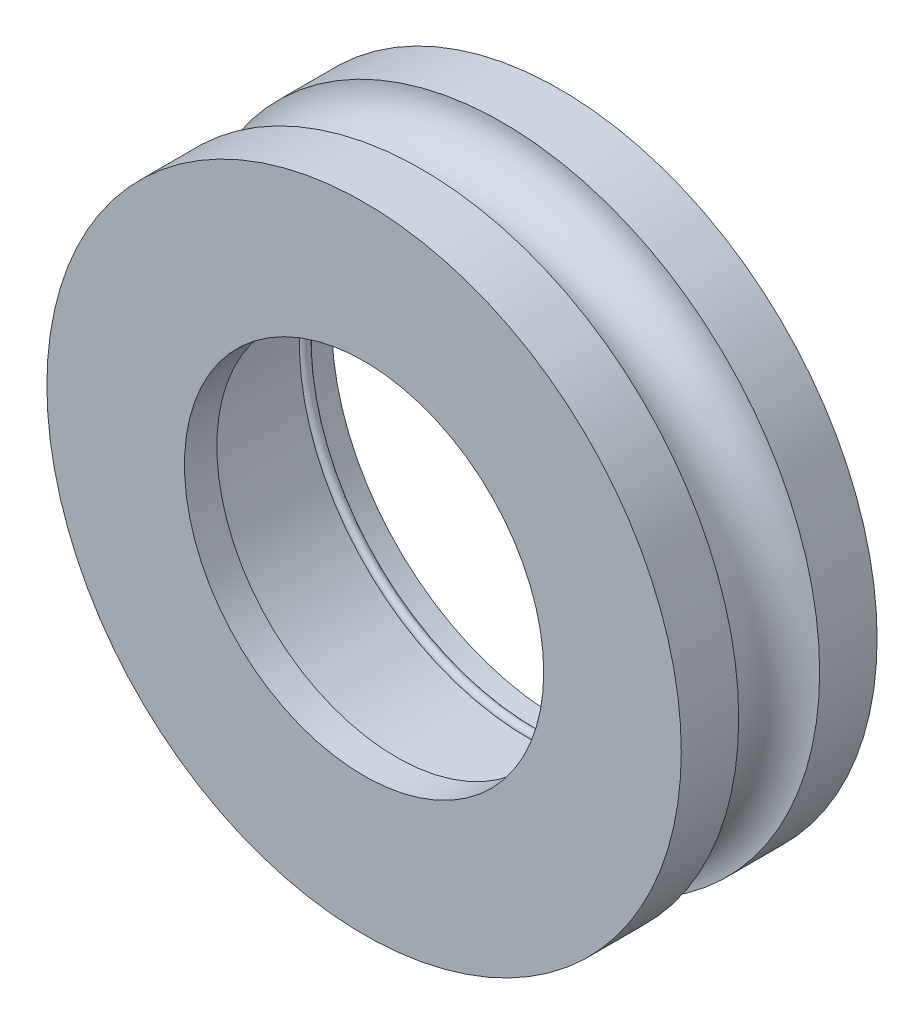
ISO-10303-21;
HEADER;
FILE_DESCRIPTION(('STEP AP214'),'2;1');
FILE_NAME('part.step','',(''),(''),'','','');
FILE_SCHEMA(('AUTOMOTIVE_DESIGN { 1 0 10303 214 1 1 1 1 }'));
ENDSEC;
DATA;
#1=APPLICATION_CONTEXT('core data for automotive mechanical design processes');
#2=APPLICATION_PROTOCOL_DEFINITION('international standard','automotive_design',2000,#1);
#3=PRODUCT_CONTEXT('',#1,'mechanical');
#4=PRODUCT('Part','Part','',(#3));
#5=PRODUCT_RELATED_PRODUCT_CATEGORY('part','',(#4));
#6=PRODUCT_DEFINITION_FORMATION('','',#4);
#7=PRODUCT_DEFINITION_CONTEXT('part definition',#1,'design');
#8=PRODUCT_DEFINITION('design','',#6,#7);
#9=PRODUCT_DEFINITION_SHAPE('','',#8);
#10=(LENGTH_UNIT() NAMED_UNIT(*) SI_UNIT(.MILLI.,.METRE.));
#11=(NAMED_UNIT(*) PLANE_ANGLE_UNIT() SI_UNIT($,.RADIAN.));
#12=(NAMED_UNIT(*) SI_UNIT($,.STERADIAN.) SOLID_ANGLE_UNIT());
#13=UNCERTAINTY_MEASURE_WITH_UNIT(LENGTH_MEASURE(1.E-05),#10,'distance_accuracy_value','');
#14=(GEOMETRIC_REPRESENTATION_CONTEXT(3) GLOBAL_UNCERTAINTY_ASSIGNED_CONTEXT((#13)) GLOBAL_UNIT_ASSIGNED_CONTEXT((#10,
#11,#12)) REPRESENTATION_CONTEXT('',''));
#15=CARTESIAN_POINT('',(0.,0.,0.));
#16=DIRECTION('',(0.,0.,1.));
#17=DIRECTION('',(1.,0.,0.));
#18=AXIS2_PLACEMENT_3D('',#15,#16,#17);
#19=CARTESIAN_POINT('',(0.,0.,2.));
#20=DIRECTION('',(0.,0.,1.));
#21=DIRECTION('',(1.,0.,0.));
#22=AXIS2_PLACEMENT_3D('',#19,#20,#21);
#23=PLANE('',#22);
#24=CARTESIAN_POINT('',(0.,0.,2.));
#25=DIRECTION('',(0.,0.,1.));
#26=DIRECTION('',(1.,0.,0.));
#27=AXIS2_PLACEMENT_3D('',#24,#25,#26);
#28=CIRCLE('',#27,11.1);
#29=CARTESIAN_POINT('',(11.1,0.,2.));
#30=VERTEX_POINT('',#29);
#31=EDGE_CURVE('E45',#30,#30,#28,.T.);
#32=ORIENTED_EDGE('',*,*,#31,.F.);
#33=EDGE_LOOP('',(#32));
#34=FACE_BOUND('',#33,.T.);
#35=CARTESIAN_POINT('',(0.,0.,2.));
#36=DIRECTION('',(0.,0.,1.));
#37=DIRECTION('',(1.,0.,0.));
#38=AXIS2_PLACEMENT_3D('',#35,#36,#37);
#39=CIRCLE('',#38,19.6);
#40=CARTESIAN_POINT('',(19.6,0.,2.));
#41=VERTEX_POINT('',#40);
#42=EDGE_CURVE('E360',#41,#41,#39,.T.);
#43=ORIENTED_EDGE('',*,*,#42,.T.);
#44=EDGE_LOOP('',(#43));
#45=FACE_BOUND('',#44,.T.);
#46=ADVANCED_FACE('F36',(#34,#45),#23,.T.);
#47=CARTESIAN_POINT('',(0.,0.,0.));
#48=DIRECTION('',(0.,0.,1.));
#49=DIRECTION('',(1.,0.,0.));
#50=AXIS2_PLACEMENT_3D('',#47,#48,#49);
#51=PLANE('',#50);
#52=CARTESIAN_POINT('',(0.,0.,0.));
#53=DIRECTION('',(0.,0.,1.));
#54=DIRECTION('',(1.,0.,0.));
#55=AXIS2_PLACEMENT_3D('',#52,#53,#54);
#56=CIRCLE('',#55,14.1);
#57=CARTESIAN_POINT('',(14.1,0.,0.));
#58=VERTEX_POINT('',#57);
#59=EDGE_CURVE('E11',#58,#58,#56,.T.);
#60=ORIENTED_EDGE('',*,*,#59,.F.);
#61=EDGE_LOOP('',(#60));
#62=FACE_BOUND('',#61,.T.);
#63=CARTESIAN_POINT('',(0.,0.,0.));
#64=DIRECTION('',(0.,0.,1.));
#65=DIRECTION('',(1.,0.,0.));
#66=AXIS2_PLACEMENT_3D('',#63,#64,#65);
#67=CIRCLE('',#66,11.1);
#68=CARTESIAN_POINT('',(11.1,0.,0.));
#69=VERTEX_POINT('',#68);
#70=EDGE_CURVE('E393',#69,#69,#67,.T.);
#71=ORIENTED_EDGE('',*,*,#70,.T.);
#72=EDGE_LOOP('',(#71));
#73=FACE_BOUND('',#72,.T.);
#74=ADVANCED_FACE('F38',(#62,#73),#51,.F.);
#75=CARTESIAN_POINT('',(0.,0.,2.));
#76=DIRECTION('',(0.,0.,-1.));
#77=DIRECTION('',(-1.,0.,0.));
#78=AXIS2_PLACEMENT_3D('',#75,#76,#77);
#79=CYLINDRICAL_SURFACE('',#78,11.1);
#80=ORIENTED_EDGE('',*,*,#31,.T.);
#81=EDGE_LOOP('',(#80));
#82=FACE_BOUND('',#81,.T.);
#83=ORIENTED_EDGE('',*,*,#70,.F.);
#84=EDGE_LOOP('',(#83));
#85=FACE_BOUND('',#84,.T.);
#86=ADVANCED_FACE('F401',(#82,#85),#79,.F.);
#87=CARTESIAN_POINT('',(0.,0.,0.));
#88=DIRECTION('',(0.,0.,1.));
#89=DIRECTION('',(1.,0.,0.));
#90=AXIS2_PLACEMENT_3D('',#87,#88,#89);
#91=CYLINDRICAL_SURFACE('',#90,14.1);
#92=CARTESIAN_POINT('',(0.,0.,-8.1));
#93=DIRECTION('',(0.,0.,1.));
#94=DIRECTION('',(1.,0.,0.));
#95=AXIS2_PLACEMENT_3D('',#92,#93,#94);
#96=CIRCLE('',#95,14.1);
#97=CARTESIAN_POINT('',(14.1,0.,-8.1));
#98=VERTEX_POINT('',#97);
#99=EDGE_CURVE('E389',#98,#98,#96,.T.);
#100=ORIENTED_EDGE('',*,*,#99,.F.);
#101=EDGE_LOOP('',(#100));
#102=FACE_BOUND('',#101,.T.);
#103=ORIENTED_EDGE('',*,*,#59,.T.);
#104=EDGE_LOOP('',(#103));
#105=FACE_BOUND('',#104,.T.);
#106=ADVANCED_FACE('F403',(#102,#105),#91,.F.);
#107=CARTESIAN_POINT('',(0.,0.,-8.4));
#108=DIRECTION('',(0.,0.,1.));
#109=DIRECTION('',(1.,0.,0.));
#110=AXIS2_PLACEMENT_3D('',#107,#108,#109);
#111=TOROIDAL_SURFACE('',#110,14.1,0.3);
#112=ORIENTED_EDGE('',*,*,#99,.T.);
#113=EDGE_LOOP('',(#112));
#114=FACE_BOUND('',#113,.T.);
#115=CARTESIAN_POINT('',(0.,0.,-8.7));
#116=DIRECTION('',(0.,0.,1.));
#117=DIRECTION('',(1.,0.,0.));
#118=AXIS2_PLACEMENT_3D('',#115,#116,#117);
#119=CIRCLE('',#118,14.1);
#120=CARTESIAN_POINT('',(14.1,0.,-8.7));
#121=VERTEX_POINT('',#120);
#122=EDGE_CURVE('E385',#121,#121,#119,.T.);
#123=ORIENTED_EDGE('',*,*,#122,.F.);
#124=EDGE_LOOP('',(#123));
#125=FACE_BOUND('',#124,.T.);
#126=ADVANCED_FACE('F410',(#114,#125),#111,.T.);
#127=CARTESIAN_POINT('',(0.,0.,0.));
#128=DIRECTION('',(0.,0.,1.));
#129=DIRECTION('',(1.,0.,0.));
#130=AXIS2_PLACEMENT_3D('',#127,#128,#129);
#131=CYLINDRICAL_SURFACE('',#130,14.1);
#132=ORIENTED_EDGE('',*,*,#122,.T.);
#133=EDGE_LOOP('',(#132));
#134=FACE_BOUND('',#133,.T.);
#135=CARTESIAN_POINT('',(0.,0.,-10.1));
#136=DIRECTION('',(0.,0.,1.));
#137=DIRECTION('',(1.,0.,0.));
#138=AXIS2_PLACEMENT_3D('',#135,#136,#137);
#139=CIRCLE('',#138,14.1);
#140=CARTESIAN_POINT('',(14.1,0.,-10.1));
#141=VERTEX_POINT('',#140);
#142=EDGE_CURVE('E381',#141,#141,#139,.T.);
#143=ORIENTED_EDGE('',*,*,#142,.F.);
#144=EDGE_LOOP('',(#143));
#145=FACE_BOUND('',#144,.T.);
#146=ADVANCED_FACE('F446',(#134,#145),#131,.F.);
#147=CARTESIAN_POINT('',(14.1,0.,-10.1));
#148=DIRECTION('',(0.,0.,-1.));
#149=DIRECTION('',(-1.,0.,0.));
#150=AXIS2_PLACEMENT_3D('',#147,#148,#149);
#151=PLANE('',#150);
#152=DIRECTION('',(0.5,0.866025403784438,0.));
#153=VECTOR('',#152,1.);
#154=CARTESIAN_POINT('',(13.0925280537665,-9.29102540378535,-10.1));
#155=LINE('',#154,#153);
#156=CARTESIAN_POINT('',(13.0925280537665,-9.29102540378535,-10.1));
#157=VERTEX_POINT('',#156);
#158=CARTESIAN_POINT('',(14.5925280537665,-6.69294919243204,-10.1));
#159=VERTEX_POINT('',#158);
#160=EDGE_CURVE('E52',#157,#159,#155,.T.);
#161=ORIENTED_EDGE('',*,*,#160,.F.);
#162=DIRECTION('',(-1.,0.,0.));
#163=VECTOR('',#162,1.);
#164=CARTESIAN_POINT('',(16.0925280537665,-9.29102540378535,-10.1));
#165=LINE('',#164,#163);
#166=CARTESIAN_POINT('',(16.0925280537665,-9.29102540378535,-10.1));
#167=VERTEX_POINT('',#166);
#168=EDGE_CURVE('E244',#167,#157,#165,.T.);
#169=ORIENTED_EDGE('',*,*,#168,.F.);
#170=DIRECTION('',(0.5,-0.866025403784439,0.));
#171=VECTOR('',#170,1.);
#172=CARTESIAN_POINT('',(14.5925280537665,-6.69294919243204,-10.1));
#173=LINE('',#172,#171);
#174=EDGE_CURVE('E255',#159,#167,#173,.T.);
#175=ORIENTED_EDGE('',*,*,#174,.F.);
#176=EDGE_LOOP('',(#161,#169,#175));
#177=FACE_BOUND('',#176,.T.);
#178=DIRECTION('',(1.,0.,0.));
#179=VECTOR('',#178,1.);
#180=CARTESIAN_POINT('',(-1.5000000000018,-15.9839745962157,-10.1));
#181=LINE('',#180,#179);
#182=CARTESIAN_POINT('',(-1.5000000000018,-15.9839745962157,-10.1));
#183=VERTEX_POINT('',#182);
#184=CARTESIAN_POINT('',(1.4999999999982,-15.9839745962157,-10.1));
#185=VERTEX_POINT('',#184);
#186=EDGE_CURVE('E60',#183,#185,#181,.T.);
#187=ORIENTED_EDGE('',*,*,#186,.F.);
#188=DIRECTION('',(-0.5,0.866025403784439,0.));
#189=VECTOR('',#188,1.);
#190=CARTESIAN_POINT('',(-1.79885403447932E-12,-18.582050807569,-10.1));
#191=LINE('',#190,#189);
#192=CARTESIAN_POINT('',(-1.79885403447932E-12,-18.582050807569,-10.1));
#193=VERTEX_POINT('',#192);
#194=EDGE_CURVE('E211',#193,#183,#191,.T.);
#195=ORIENTED_EDGE('',*,*,#194,.F.);
#196=DIRECTION('',(-0.5,-0.866025403784439,0.));
#197=VECTOR('',#196,1.);
#198=CARTESIAN_POINT('',(1.4999999999982,-15.9839745962157,-10.1));
#199=LINE('',#198,#197);
#200=EDGE_CURVE('E222',#185,#193,#199,.T.);
#201=ORIENTED_EDGE('',*,*,#200,.F.);
#202=EDGE_LOOP('',(#187,#195,#201));
#203=FACE_BOUND('',#202,.T.);
#204=DIRECTION('',(0.5,-0.866025403784439,0.));
#205=VECTOR('',#204,1.);
#206=CARTESIAN_POINT('',(-14.5925280537692,-6.69294919243047,-10.1));
#207=LINE('',#206,#205);
#208=CARTESIAN_POINT('',(-14.5925280537692,-6.69294919243047,-10.1));
#209=VERTEX_POINT('',#208);
#210=CARTESIAN_POINT('',(-13.0925280537692,-9.29102540378378,-10.1));
#211=VERTEX_POINT('',#210);
#212=EDGE_CURVE('E233',#209,#211,#207,.T.);
#213=ORIENTED_EDGE('',*,*,#212,.F.);
#214=DIRECTION('',(0.5,0.866025403784439,0.));
#215=VECTOR('',#214,1.);
#216=CARTESIAN_POINT('',(-16.0925280537692,-9.29102540378379,-10.1));
#217=LINE('',#216,#215);
#218=CARTESIAN_POINT('',(-16.0925280537692,-9.29102540378379,-10.1));
#219=VERTEX_POINT('',#218);
#220=EDGE_CURVE('E309',#219,#209,#217,.T.);
#221=ORIENTED_EDGE('',*,*,#220,.F.);
#222=DIRECTION('',(-1.,0.,0.));
#223=VECTOR('',#222,1.);
#224=CARTESIAN_POINT('',(-13.0925280537692,-9.29102540378378,-10.1));
#225=LINE('',#224,#223);
#226=EDGE_CURVE('E320',#211,#219,#225,.T.);
#227=ORIENTED_EDGE('',*,*,#226,.F.);
#228=EDGE_LOOP('',(#213,#221,#227));
#229=FACE_BOUND('',#228,.T.);
#230=DIRECTION('',(-1.,0.,0.));
#231=VECTOR('',#230,1.);
#232=CARTESIAN_POINT('',(1.5,15.9839745962156,-10.1));
#233=LINE('',#232,#231);
#234=CARTESIAN_POINT('',(1.5,15.9839745962156,-10.1));
#235=VERTEX_POINT('',#234);
#236=CARTESIAN_POINT('',(-1.5,15.9839745962156,-10.1));
#237=VERTEX_POINT('',#236);
#238=EDGE_CURVE('E283',#235,#237,#233,.T.);
#239=ORIENTED_EDGE('',*,*,#238,.F.);
#240=DIRECTION('',(0.5,-0.866025403784439,0.));
#241=VECTOR('',#240,1.);
#242=CARTESIAN_POINT('',(0.,18.5820508075689,-10.1));
#243=LINE('',#242,#241);
#244=CARTESIAN_POINT('',(0.,18.5820508075689,-10.1));
#245=VERTEX_POINT('',#244);
#246=EDGE_CURVE('E274',#245,#235,#243,.T.);
#247=ORIENTED_EDGE('',*,*,#246,.F.);
#248=DIRECTION('',(0.5,0.866025403784439,0.));
#249=VECTOR('',#248,1.);
#250=CARTESIAN_POINT('',(-1.5,15.9839745962156,-10.1));
#251=LINE('',#250,#249);
#252=EDGE_CURVE('E286',#237,#245,#251,.T.);
#253=ORIENTED_EDGE('',*,*,#252,.F.);
#254=EDGE_LOOP('',(#239,#247,#253));
#255=FACE_BOUND('',#254,.T.);
#256=DIRECTION('',(-0.5,0.866025403784439,0.));
#257=VECTOR('',#256,1.);
#258=CARTESIAN_POINT('',(14.5925280537674,6.69294919243029,-10.1));
#259=LINE('',#258,#257);
#260=CARTESIAN_POINT('',(14.5925280537674,6.69294919243029,-10.1));
#261=VERTEX_POINT('',#260);
#262=CARTESIAN_POINT('',(13.0925280537674,9.29102540378361,-10.1));
#263=VERTEX_POINT('',#262);
#264=EDGE_CURVE('E169',#261,#263,#259,.T.);
#265=ORIENTED_EDGE('',*,*,#264,.F.);
#266=DIRECTION('',(-0.500000000000001,-0.866025403784438,0.));
#267=VECTOR('',#266,1.);
#268=CARTESIAN_POINT('',(16.0925280537674,9.2910254037836,-10.1));
#269=LINE('',#268,#267);
#270=CARTESIAN_POINT('',(16.0925280537674,9.2910254037836,-10.1));
#271=VERTEX_POINT('',#270);
#272=EDGE_CURVE('E186',#271,#261,#269,.T.);
#273=ORIENTED_EDGE('',*,*,#272,.F.);
#274=DIRECTION('',(1.,0.,0.));
#275=VECTOR('',#274,1.);
#276=CARTESIAN_POINT('',(13.0925280537674,9.29102540378361,-10.1));
#277=LINE('',#276,#275);
#278=EDGE_CURVE('E192',#263,#271,#277,.T.);
#279=ORIENTED_EDGE('',*,*,#278,.F.);
#280=EDGE_LOOP('',(#265,#273,#279));
#281=FACE_BOUND('',#280,.T.);
#282=DIRECTION('',(-0.500000000000001,-0.866025403784438,0.));
#283=VECTOR('',#282,1.);
#284=CARTESIAN_POINT('',(-13.0925280537683,9.29102540378518,-10.1));
#285=LINE('',#284,#283);
#286=CARTESIAN_POINT('',(-13.0925280537683,9.29102540378518,-10.1));
#287=VERTEX_POINT('',#286);
#288=CARTESIAN_POINT('',(-14.5925280537683,6.69294919243186,-10.1));
#289=VERTEX_POINT('',#288);
#290=EDGE_CURVE('E297',#287,#289,#285,.T.);
#291=ORIENTED_EDGE('',*,*,#290,.F.);
#292=DIRECTION('',(1.,0.,0.));
#293=VECTOR('',#292,1.);
#294=CARTESIAN_POINT('',(-16.0925280537683,9.29102540378518,-10.1));
#295=LINE('',#294,#293);
#296=CARTESIAN_POINT('',(-16.0925280537683,9.29102540378518,-10.1));
#297=VERTEX_POINT('',#296);
#298=EDGE_CURVE('E339',#297,#287,#295,.T.);
#299=ORIENTED_EDGE('',*,*,#298,.F.);
#300=DIRECTION('',(-0.499999999999999,0.866025403784439,0.));
#301=VECTOR('',#300,1.);
#302=CARTESIAN_POINT('',(-14.5925280537683,6.69294919243186,-10.1));
#303=LINE('',#302,#301);
#304=EDGE_CURVE('E350',#289,#297,#303,.T.);
#305=ORIENTED_EDGE('',*,*,#304,.F.);
#306=EDGE_LOOP('',(#291,#299,#305));
#307=FACE_BOUND('',#306,.T.);
#308=ORIENTED_EDGE('',*,*,#142,.T.);
#309=EDGE_LOOP('',(#308));
#310=FACE_BOUND('',#309,.T.);
#311=CARTESIAN_POINT('',(0.,0.,-10.1));
#312=DIRECTION('',(0.,0.,1.));
#313=DIRECTION('',(1.,0.,0.));
#314=AXIS2_PLACEMENT_3D('',#311,#312,#313);
#315=CIRCLE('',#314,19.6);
#316=CARTESIAN_POINT('',(19.6,0.,-10.1));
#317=VERTEX_POINT('',#316);
#318=EDGE_CURVE('E377',#317,#317,#315,.T.);
#319=ORIENTED_EDGE('',*,*,#318,.F.);
#320=EDGE_LOOP('',(#319));
#321=FACE_BOUND('',#320,.T.);
#322=ADVANCED_FACE('F442',(#177,#203,#229,#255,#281,#307,#310,#321),#151,.T.);
#323=CARTESIAN_POINT('',(0.,0.,0.));
#324=DIRECTION('',(0.,0.,1.));
#325=DIRECTION('',(1.,0.,0.));
#326=AXIS2_PLACEMENT_3D('',#323,#324,#325);
#327=CYLINDRICAL_SURFACE('',#326,19.6);
#328=ORIENTED_EDGE('',*,*,#318,.T.);
#329=EDGE_LOOP('',(#328));
#330=FACE_BOUND('',#329,.T.);
#331=CARTESIAN_POINT('',(0.,0.,-6.55));
#332=DIRECTION('',(0.,0.,1.));
#333=DIRECTION('',(1.,0.,0.));
#334=AXIS2_PLACEMENT_3D('',#331,#332,#333);
#335=CIRCLE('',#334,19.6);
#336=CARTESIAN_POINT('',(19.6,0.,-6.55));
#337=VERTEX_POINT('',#336);
#338=EDGE_CURVE('E373',#337,#337,#335,.T.);
#339=ORIENTED_EDGE('',*,*,#338,.F.);
#340=EDGE_LOOP('',(#339));
#341=FACE_BOUND('',#340,.T.);
#342=ADVANCED_FACE('F435',(#330,#341),#327,.T.);
#343=CARTESIAN_POINT('',(0.,0.,-4.05));
#344=DIRECTION('',(0.,0.,1.));
#345=DIRECTION('',(1.,0.,0.));
#346=AXIS2_PLACEMENT_3D('',#343,#344,#345);
#347=TOROIDAL_SURFACE('',#346,19.6,2.5);
#348=ORIENTED_EDGE('',*,*,#338,.T.);
#349=EDGE_LOOP('',(#348));
#350=FACE_BOUND('',#349,.T.);
#351=CARTESIAN_POINT('',(0.,0.,-1.55));
#352=DIRECTION('',(0.,0.,1.));
#353=DIRECTION('',(1.,0.,0.));
#354=AXIS2_PLACEMENT_3D('',#351,#352,#353);
#355=CIRCLE('',#354,19.6);
#356=CARTESIAN_POINT('',(19.6,0.,-1.55));
#357=VERTEX_POINT('',#356);
#358=EDGE_CURVE('E369',#357,#357,#355,.T.);
#359=ORIENTED_EDGE('',*,*,#358,.F.);
#360=EDGE_LOOP('',(#359));
#361=FACE_BOUND('',#360,.T.);
#362=ADVANCED_FACE('F425',(#350,#361),#347,.F.);
#363=CARTESIAN_POINT('',(0.,0.,0.));
#364=DIRECTION('',(0.,0.,1.));
#365=DIRECTION('',(1.,0.,0.));
#366=AXIS2_PLACEMENT_3D('',#363,#364,#365);
#367=CYLINDRICAL_SURFACE('',#366,19.6);
#368=ORIENTED_EDGE('',*,*,#358,.T.);
#369=EDGE_LOOP('',(#368));
#370=FACE_BOUND('',#369,.T.);
#371=ORIENTED_EDGE('',*,*,#42,.F.);
#372=EDGE_LOOP('',(#371));
#373=FACE_BOUND('',#372,.T.);
#374=ADVANCED_FACE('F422',(#370,#373),#367,.T.);
#375=CARTESIAN_POINT('',(-13.0925280537683,9.29102540378518,-9.1));
#376=DIRECTION('',(0.866025403784438,-0.500000000000001,0.));
#377=DIRECTION('',(0.500000000000001,0.866025403784438,0.));
#378=AXIS2_PLACEMENT_3D('',#375,#376,#377);
#379=PLANE('',#378);
#380=ORIENTED_EDGE('',*,*,#290,.T.);
#381=DIRECTION('',(0.,0.,-1.));
#382=VECTOR('',#381,1.);
#383=CARTESIAN_POINT('',(-14.5925280537683,6.69294919243186,-9.1));
#384=LINE('',#383,#382);
#385=CARTESIAN_POINT('',(-14.5925280537683,6.69294919243186,-9.1));
#386=VERTEX_POINT('',#385);
#387=EDGE_CURVE('E347',#386,#289,#384,.T.);
#388=ORIENTED_EDGE('',*,*,#387,.F.);
#389=DIRECTION('',(-0.500000000000001,-0.866025403784438,0.));
#390=VECTOR('',#389,1.);
#391=CARTESIAN_POINT('',(-13.0925280537683,9.29102540378518,-9.1));
#392=LINE('',#391,#390);
#393=CARTESIAN_POINT('',(-13.0925280537683,9.29102540378518,-9.1));
#394=VERTEX_POINT('',#393);
#395=EDGE_CURVE('E334',#394,#386,#392,.T.);
#396=ORIENTED_EDGE('',*,*,#395,.F.);
#397=DIRECTION('',(0.,0.,-1.));
#398=VECTOR('',#397,1.);
#399=CARTESIAN_POINT('',(-13.0925280537683,9.29102540378518,-9.1));
#400=LINE('',#399,#398);
#401=EDGE_CURVE('E357',#394,#287,#400,.T.);
#402=ORIENTED_EDGE('',*,*,#401,.T.);
#403=EDGE_LOOP('',(#380,#388,#396,#402));
#404=FACE_BOUND('',#403,.T.);
#405=ADVANCED_FACE('F424',(#404),#379,.F.);
#406=CARTESIAN_POINT('',(-16.0925280537683,9.29102540378518,-9.1));
#407=DIRECTION('',(0.,1.,0.));
#408=DIRECTION('',(-1.,0.,0.));
#409=AXIS2_PLACEMENT_3D('',#406,#407,#408);
#410=PLANE('',#409);
#411=ORIENTED_EDGE('',*,*,#298,.T.);
#412=ORIENTED_EDGE('',*,*,#401,.F.);
#413=DIRECTION('',(1.,0.,0.));
#414=VECTOR('',#413,1.);
#415=CARTESIAN_POINT('',(-16.0925280537683,9.29102540378518,-9.1));
#416=LINE('',#415,#414);
#417=CARTESIAN_POINT('',(-16.0925280537683,9.29102540378518,-9.1));
#418=VERTEX_POINT('',#417);
#419=EDGE_CURVE('E343',#418,#394,#416,.T.);
#420=ORIENTED_EDGE('',*,*,#419,.F.);
#421=DIRECTION('',(0.,0.,-1.));
#422=VECTOR('',#421,1.);
#423=CARTESIAN_POINT('',(-16.0925280537683,9.29102540378518,-9.1));
#424=LINE('',#423,#422);
#425=EDGE_CURVE('E361',#418,#297,#424,.T.);
#426=ORIENTED_EDGE('',*,*,#425,.T.);
#427=EDGE_LOOP('',(#411,#412,#420,#426));
#428=FACE_BOUND('',#427,.T.);
#429=ADVANCED_FACE('F432',(#428),#410,.F.);
#430=CARTESIAN_POINT('',(-14.5925280537683,6.69294919243186,-9.1));
#431=DIRECTION('',(-0.866025403784439,-0.499999999999999,0.));
#432=DIRECTION('',(0.499999999999999,-0.866025403784439,0.));
#433=AXIS2_PLACEMENT_3D('',#430,#431,#432);
#434=PLANE('',#433);
#435=ORIENTED_EDGE('',*,*,#304,.T.);
#436=ORIENTED_EDGE('',*,*,#425,.F.);
#437=DIRECTION('',(-0.499999999999999,0.866025403784439,0.));
#438=VECTOR('',#437,1.);
#439=CARTESIAN_POINT('',(-14.5925280537683,6.69294919243186,-9.1));
#440=LINE('',#439,#438);
#441=EDGE_CURVE('E338',#386,#418,#440,.T.);
#442=ORIENTED_EDGE('',*,*,#441,.F.);
#443=ORIENTED_EDGE('',*,*,#387,.T.);
#444=EDGE_LOOP('',(#435,#436,#442,#443));
#445=FACE_BOUND('',#444,.T.);
#446=ADVANCED_FACE('F498',(#445),#434,.F.);
#447=CARTESIAN_POINT('',(0.,0.,-9.1));
#448=DIRECTION('',(0.,0.,-1.));
#449=DIRECTION('',(-1.,0.,0.));
#450=AXIS2_PLACEMENT_3D('',#447,#448,#449);
#451=PLANE('',#450);
#452=ORIENTED_EDGE('',*,*,#395,.T.);
#453=ORIENTED_EDGE('',*,*,#441,.T.);
#454=ORIENTED_EDGE('',*,*,#419,.T.);
#455=EDGE_LOOP('',(#452,#453,#454));
#456=FACE_BOUND('',#455,.T.);
#457=ADVANCED_FACE('F507',(#456),#451,.T.);
#458=CARTESIAN_POINT('',(14.5925280537674,6.69294919243029,-9.1));
#459=DIRECTION('',(-0.866025403784439,-0.5,0.));
#460=DIRECTION('',(0.5,-0.866025403784439,0.));
#461=AXIS2_PLACEMENT_3D('',#458,#459,#460);
#462=PLANE('',#461);
#463=ORIENTED_EDGE('',*,*,#264,.T.);
#464=DIRECTION('',(0.,0.,-1.));
#465=VECTOR('',#464,1.);
#466=CARTESIAN_POINT('',(13.0925280537674,9.29102540378361,-9.1));
#467=LINE('',#466,#465);
#468=CARTESIAN_POINT('',(13.0925280537674,9.29102540378361,-9.1));
#469=VERTEX_POINT('',#468);
#470=EDGE_CURVE('E162',#469,#263,#467,.T.);
#471=ORIENTED_EDGE('',*,*,#470,.F.);
#472=DIRECTION('',(-0.5,0.866025403784439,0.));
#473=VECTOR('',#472,1.);
#474=CARTESIAN_POINT('',(14.5925280537674,6.69294919243029,-9.1));
#475=LINE('',#474,#473);
#476=CARTESIAN_POINT('',(14.5925280537674,6.69294919243029,-9.1));
#477=VERTEX_POINT('',#476);
#478=EDGE_CURVE('E166',#477,#469,#475,.T.);
#479=ORIENTED_EDGE('',*,*,#478,.F.);
#480=DIRECTION('',(0.,0.,-1.));
#481=VECTOR('',#480,1.);
#482=CARTESIAN_POINT('',(14.5925280537674,6.69294919243029,-9.1));
#483=LINE('',#482,#481);
#484=EDGE_CURVE('E201',#477,#261,#483,.T.);
#485=ORIENTED_EDGE('',*,*,#484,.T.);
#486=EDGE_LOOP('',(#463,#471,#479,#485));
#487=FACE_BOUND('',#486,.T.);
#488=ADVANCED_FACE('F164',(#487),#462,.F.);
#489=CARTESIAN_POINT('',(16.0925280537674,9.2910254037836,-9.1));
#490=DIRECTION('',(0.866025403784438,-0.500000000000001,0.));
#491=DIRECTION('',(0.500000000000001,0.866025403784438,0.));
#492=AXIS2_PLACEMENT_3D('',#489,#490,#491);
#493=PLANE('',#492);
#494=ORIENTED_EDGE('',*,*,#272,.T.);
#495=ORIENTED_EDGE('',*,*,#484,.F.);
#496=DIRECTION('',(-0.500000000000001,-0.866025403784438,0.));
#497=VECTOR('',#496,1.);
#498=CARTESIAN_POINT('',(16.0925280537674,9.2910254037836,-9.1));
#499=LINE('',#498,#497);
#500=CARTESIAN_POINT('',(16.0925280537674,9.2910254037836,-9.1));
#501=VERTEX_POINT('',#500);
#502=EDGE_CURVE('E175',#501,#477,#499,.T.);
#503=ORIENTED_EDGE('',*,*,#502,.F.);
#504=DIRECTION('',(0.,0.,-1.));
#505=VECTOR('',#504,1.);
#506=CARTESIAN_POINT('',(16.0925280537674,9.2910254037836,-9.1));
#507=LINE('',#506,#505);
#508=EDGE_CURVE('E174',#501,#271,#507,.T.);
#509=ORIENTED_EDGE('',*,*,#508,.T.);
#510=EDGE_LOOP('',(#494,#495,#503,#509));
#511=FACE_BOUND('',#510,.T.);
#512=ADVANCED_FACE('F523',(#511),#493,.F.);
#513=CARTESIAN_POINT('',(13.0925280537674,9.29102540378361,-9.1));
#514=DIRECTION('',(0.,1.,0.));
#515=DIRECTION('',(-1.,0.,0.));
#516=AXIS2_PLACEMENT_3D('',#513,#514,#515);
#517=PLANE('',#516);
#518=ORIENTED_EDGE('',*,*,#278,.T.);
#519=ORIENTED_EDGE('',*,*,#508,.F.);
#520=DIRECTION('',(1.,0.,0.));
#521=VECTOR('',#520,1.);
#522=CARTESIAN_POINT('',(13.0925280537674,9.29102540378361,-9.1));
#523=LINE('',#522,#521);
#524=EDGE_CURVE('E178',#469,#501,#523,.T.);
#525=ORIENTED_EDGE('',*,*,#524,.F.);
#526=ORIENTED_EDGE('',*,*,#470,.T.);
#527=EDGE_LOOP('',(#518,#519,#525,#526));
#528=FACE_BOUND('',#527,.T.);
#529=ADVANCED_FACE('F179',(#528),#517,.F.);
#530=CARTESIAN_POINT('',(0.,0.,-9.1));
#531=DIRECTION('',(0.,0.,-1.));
#532=DIRECTION('',(-1.,0.,0.));
#533=AXIS2_PLACEMENT_3D('',#530,#531,#532);
#534=PLANE('',#533);
#535=ORIENTED_EDGE('',*,*,#478,.T.);
#536=ORIENTED_EDGE('',*,*,#524,.T.);
#537=ORIENTED_EDGE('',*,*,#502,.T.);
#538=EDGE_LOOP('',(#535,#536,#537));
#539=FACE_BOUND('',#538,.T.);
#540=ADVANCED_FACE('F184',(#539),#534,.T.);
#541=CARTESIAN_POINT('',(1.5,15.9839745962156,-9.1));
#542=DIRECTION('',(0.,-1.,0.));
#543=DIRECTION('',(0.,0.,-1.));
#544=AXIS2_PLACEMENT_3D('',#541,#542,#543);
#545=PLANE('',#544);
#546=ORIENTED_EDGE('',*,*,#238,.T.);
#547=DIRECTION('',(0.,0.,-1.));
#548=VECTOR('',#547,1.);
#549=CARTESIAN_POINT('',(-1.5,15.9839745962156,-9.1));
#550=LINE('',#549,#548);
#551=CARTESIAN_POINT('',(-1.5,15.9839745962156,-9.1));
#552=VERTEX_POINT('',#551);
#553=EDGE_CURVE('E282',#552,#237,#550,.T.);
#554=ORIENTED_EDGE('',*,*,#553,.F.);
#555=DIRECTION('',(-1.,0.,0.));
#556=VECTOR('',#555,1.);
#557=CARTESIAN_POINT('',(1.5,15.9839745962156,-9.1));
#558=LINE('',#557,#556);
#559=CARTESIAN_POINT('',(1.5,15.9839745962156,-9.1));
#560=VERTEX_POINT('',#559);
#561=EDGE_CURVE('E269',#560,#552,#558,.T.);
#562=ORIENTED_EDGE('',*,*,#561,.F.);
#563=DIRECTION('',(0.,0.,-1.));
#564=VECTOR('',#563,1.);
#565=CARTESIAN_POINT('',(1.5,15.9839745962156,-9.1));
#566=LINE('',#565,#564);
#567=EDGE_CURVE('E294',#560,#235,#566,.T.);
#568=ORIENTED_EDGE('',*,*,#567,.T.);
#569=EDGE_LOOP('',(#546,#554,#562,#568));
#570=FACE_BOUND('',#569,.T.);
#571=ADVANCED_FACE('F546',(#570),#545,.F.);
#572=CARTESIAN_POINT('',(0.,18.5820508075689,-9.1));
#573=DIRECTION('',(0.866025403784439,0.5,0.));
#574=DIRECTION('',(-0.5,0.866025403784439,0.));
#575=AXIS2_PLACEMENT_3D('',#572,#573,#574);
#576=PLANE('',#575);
#577=ORIENTED_EDGE('',*,*,#246,.T.);
#578=ORIENTED_EDGE('',*,*,#567,.F.);
#579=DIRECTION('',(0.5,-0.866025403784439,0.));
#580=VECTOR('',#579,1.);
#581=CARTESIAN_POINT('',(0.,18.5820508075689,-9.1));
#582=LINE('',#581,#580);
#583=CARTESIAN_POINT('',(0.,18.5820508075689,-9.1));
#584=VERTEX_POINT('',#583);
#585=EDGE_CURVE('E278',#584,#560,#582,.T.);
#586=ORIENTED_EDGE('',*,*,#585,.F.);
#587=DIRECTION('',(0.,0.,-1.));
#588=VECTOR('',#587,1.);
#589=CARTESIAN_POINT('',(0.,18.5820508075689,-9.1));
#590=LINE('',#589,#588);
#591=EDGE_CURVE('E298',#584,#245,#590,.T.);
#592=ORIENTED_EDGE('',*,*,#591,.T.);
#593=EDGE_LOOP('',(#577,#578,#586,#592));
#594=FACE_BOUND('',#593,.T.);
#595=ADVANCED_FACE('F554',(#594),#576,.F.);
#596=CARTESIAN_POINT('',(-1.5,15.9839745962156,-9.1));
#597=DIRECTION('',(-0.866025403784439,0.5,0.));
#598=DIRECTION('',(-0.5,-0.866025403784439,0.));
#599=AXIS2_PLACEMENT_3D('',#596,#597,#598);
#600=PLANE('',#599);
#601=ORIENTED_EDGE('',*,*,#252,.T.);
#602=ORIENTED_EDGE('',*,*,#591,.F.);
#603=DIRECTION('',(0.5,0.866025403784439,0.));
#604=VECTOR('',#603,1.);
#605=CARTESIAN_POINT('',(-1.5,15.9839745962156,-9.1));
#606=LINE('',#605,#604);
#607=EDGE_CURVE('E273',#552,#584,#606,.T.);
#608=ORIENTED_EDGE('',*,*,#607,.F.);
#609=ORIENTED_EDGE('',*,*,#553,.T.);
#610=EDGE_LOOP('',(#601,#602,#608,#609));
#611=FACE_BOUND('',#610,.T.);
#612=ADVANCED_FACE('F563',(#611),#600,.F.);
#613=CARTESIAN_POINT('',(0.,0.,-9.1));
#614=DIRECTION('',(0.,0.,-1.));
#615=DIRECTION('',(-1.,0.,0.));
#616=AXIS2_PLACEMENT_3D('',#613,#614,#615);
#617=PLANE('',#616);
#618=ORIENTED_EDGE('',*,*,#561,.T.);
#619=ORIENTED_EDGE('',*,*,#607,.T.);
#620=ORIENTED_EDGE('',*,*,#585,.T.);
#621=EDGE_LOOP('',(#618,#619,#620));
#622=FACE_BOUND('',#621,.T.);
#623=ADVANCED_FACE('F572',(#622),#617,.T.);
#624=CARTESIAN_POINT('',(-14.5925280537692,-6.69294919243047,-9.1));
#625=DIRECTION('',(0.866025403784439,0.5,0.));
#626=DIRECTION('',(-0.5,0.866025403784439,0.));
#627=AXIS2_PLACEMENT_3D('',#624,#625,#626);
#628=PLANE('',#627);
#629=ORIENTED_EDGE('',*,*,#212,.T.);
#630=DIRECTION('',(0.,0.,-1.));
#631=VECTOR('',#630,1.);
#632=CARTESIAN_POINT('',(-13.0925280537692,-9.29102540378378,-9.1));
#633=LINE('',#632,#631);
#634=CARTESIAN_POINT('',(-13.0925280537692,-9.29102540378378,-9.1));
#635=VERTEX_POINT('',#634);
#636=EDGE_CURVE('E317',#635,#211,#633,.T.);
#637=ORIENTED_EDGE('',*,*,#636,.F.);
#638=DIRECTION('',(0.5,-0.866025403784439,0.));
#639=VECTOR('',#638,1.);
#640=CARTESIAN_POINT('',(-14.5925280537692,-6.69294919243047,-9.1));
#641=LINE('',#640,#639);
#642=CARTESIAN_POINT('',(-14.5925280537692,-6.69294919243047,-9.1));
#643=VERTEX_POINT('',#642);
#644=EDGE_CURVE('E304',#643,#635,#641,.T.);
#645=ORIENTED_EDGE('',*,*,#644,.F.);
#646=DIRECTION('',(0.,0.,-1.));
#647=VECTOR('',#646,1.);
#648=CARTESIAN_POINT('',(-14.5925280537692,-6.69294919243047,-9.1));
#649=LINE('',#648,#647);
#650=EDGE_CURVE('E287',#643,#209,#649,.T.);
#651=ORIENTED_EDGE('',*,*,#650,.T.);
#652=EDGE_LOOP('',(#629,#637,#645,#651));
#653=FACE_BOUND('',#652,.T.);
#654=ADVANCED_FACE('F581',(#653),#628,.F.);
#655=CARTESIAN_POINT('',(-16.0925280537692,-9.29102540378379,-9.1));
#656=DIRECTION('',(-0.866025403784439,0.5,0.));
#657=DIRECTION('',(-0.5,-0.866025403784439,0.));
#658=AXIS2_PLACEMENT_3D('',#655,#656,#657);
#659=PLANE('',#658);
#660=ORIENTED_EDGE('',*,*,#220,.T.);
#661=ORIENTED_EDGE('',*,*,#650,.F.);
#662=DIRECTION('',(0.5,0.866025403784439,0.));
#663=VECTOR('',#662,1.);
#664=CARTESIAN_POINT('',(-16.0925280537692,-9.29102540378379,-9.1));
#665=LINE('',#664,#663);
#666=CARTESIAN_POINT('',(-16.0925280537692,-9.29102540378379,-9.1));
#667=VERTEX_POINT('',#666);
#668=EDGE_CURVE('E313',#667,#643,#665,.T.);
#669=ORIENTED_EDGE('',*,*,#668,.F.);
#670=DIRECTION('',(0.,0.,-1.));
#671=VECTOR('',#670,1.);
#672=CARTESIAN_POINT('',(-16.0925280537692,-9.29102540378379,-9.1));
#673=LINE('',#672,#671);
#674=EDGE_CURVE('E328',#667,#219,#673,.T.);
#675=ORIENTED_EDGE('',*,*,#674,.T.);
#676=EDGE_LOOP('',(#660,#661,#669,#675));
#677=FACE_BOUND('',#676,.T.);
#678=ADVANCED_FACE('F590',(#677),#659,.F.);
#679=CARTESIAN_POINT('',(-13.0925280537692,-9.29102540378378,-9.1));
#680=DIRECTION('',(0.,-1.,0.));
#681=DIRECTION('',(1.,0.,0.));
#682=AXIS2_PLACEMENT_3D('',#679,#680,#681);
#683=PLANE('',#682);
#684=ORIENTED_EDGE('',*,*,#226,.T.);
#685=ORIENTED_EDGE('',*,*,#674,.F.);
#686=DIRECTION('',(-1.,0.,0.));
#687=VECTOR('',#686,1.);
#688=CARTESIAN_POINT('',(-13.0925280537692,-9.29102540378378,-9.1));
#689=LINE('',#688,#687);
#690=EDGE_CURVE('E308',#635,#667,#689,.T.);
#691=ORIENTED_EDGE('',*,*,#690,.F.);
#692=ORIENTED_EDGE('',*,*,#636,.T.);
#693=EDGE_LOOP('',(#684,#685,#691,#692));
#694=FACE_BOUND('',#693,.T.);
#695=ADVANCED_FACE('F599',(#694),#683,.F.);
#696=CARTESIAN_POINT('',(0.,0.,-9.1));
#697=DIRECTION('',(0.,0.,-1.));
#698=DIRECTION('',(-1.,0.,0.));
#699=AXIS2_PLACEMENT_3D('',#696,#697,#698);
#700=PLANE('',#699);
#701=ORIENTED_EDGE('',*,*,#644,.T.);
#702=ORIENTED_EDGE('',*,*,#690,.T.);
#703=ORIENTED_EDGE('',*,*,#668,.T.);
#704=EDGE_LOOP('',(#701,#702,#703));
#705=FACE_BOUND('',#704,.T.);
#706=ADVANCED_FACE('F608',(#705),#700,.T.);
#707=CARTESIAN_POINT('',(-1.5000000000018,-15.9839745962157,-9.1));
#708=DIRECTION('',(0.,1.,0.));
#709=DIRECTION('',(0.,0.,1.));
#710=AXIS2_PLACEMENT_3D('',#707,#708,#709);
#711=PLANE('',#710);
#712=ORIENTED_EDGE('',*,*,#186,.T.);
#713=DIRECTION('',(0.,0.,-1.));
#714=VECTOR('',#713,1.);
#715=CARTESIAN_POINT('',(1.4999999999982,-15.9839745962157,-9.1));
#716=LINE('',#715,#714);
#717=CARTESIAN_POINT('',(1.4999999999982,-15.9839745962157,-9.1));
#718=VERTEX_POINT('',#717);
#719=EDGE_CURVE('E219',#718,#185,#716,.T.);
#720=ORIENTED_EDGE('',*,*,#719,.F.);
#721=DIRECTION('',(1.,0.,0.));
#722=VECTOR('',#721,1.);
#723=CARTESIAN_POINT('',(-1.5000000000018,-15.9839745962157,-9.1));
#724=LINE('',#723,#722);
#725=CARTESIAN_POINT('',(-1.5000000000018,-15.9839745962157,-9.1));
#726=VERTEX_POINT('',#725);
#727=EDGE_CURVE('E206',#726,#718,#724,.T.);
#728=ORIENTED_EDGE('',*,*,#727,.F.);
#729=DIRECTION('',(0.,0.,-1.));
#730=VECTOR('',#729,1.);
#731=CARTESIAN_POINT('',(-1.5000000000018,-15.9839745962157,-9.1));
#732=LINE('',#731,#730);
#733=EDGE_CURVE('E230',#726,#183,#732,.T.);
#734=ORIENTED_EDGE('',*,*,#733,.T.);
#735=EDGE_LOOP('',(#712,#720,#728,#734));
#736=FACE_BOUND('',#735,.T.);
#737=ADVANCED_FACE('F617',(#736),#711,.F.);
#738=CARTESIAN_POINT('',(-1.79885403447932E-12,-18.582050807569,-9.1));
#739=DIRECTION('',(-0.866025403784439,-0.5,0.));
#740=DIRECTION('',(0.5,-0.866025403784439,0.));
#741=AXIS2_PLACEMENT_3D('',#738,#739,#740);
#742=PLANE('',#741);
#743=ORIENTED_EDGE('',*,*,#194,.T.);
#744=ORIENTED_EDGE('',*,*,#733,.F.);
#745=DIRECTION('',(-0.5,0.866025403784439,0.));
#746=VECTOR('',#745,1.);
#747=CARTESIAN_POINT('',(-1.79885403447932E-12,-18.582050807569,-9.1));
#748=LINE('',#747,#746);
#749=CARTESIAN_POINT('',(-1.79885403447932E-12,-18.582050807569,-9.1));
#750=VERTEX_POINT('',#749);
#751=EDGE_CURVE('E215',#750,#726,#748,.T.);
#752=ORIENTED_EDGE('',*,*,#751,.F.);
#753=DIRECTION('',(0.,0.,-1.));
#754=VECTOR('',#753,1.);
#755=CARTESIAN_POINT('',(-1.79885403447932E-12,-18.582050807569,-9.1));
#756=LINE('',#755,#754);
#757=EDGE_CURVE('E234',#750,#193,#756,.T.);
#758=ORIENTED_EDGE('',*,*,#757,.T.);
#759=EDGE_LOOP('',(#743,#744,#752,#758));
#760=FACE_BOUND('',#759,.T.);
#761=ADVANCED_FACE('F626',(#760),#742,.F.);
#762=CARTESIAN_POINT('',(1.4999999999982,-15.9839745962157,-9.1));
#763=DIRECTION('',(0.866025403784439,-0.5,0.));
#764=DIRECTION('',(0.5,0.866025403784439,0.));
#765=AXIS2_PLACEMENT_3D('',#762,#763,#764);
#766=PLANE('',#765);
#767=ORIENTED_EDGE('',*,*,#200,.T.);
#768=ORIENTED_EDGE('',*,*,#757,.F.);
#769=DIRECTION('',(-0.5,-0.866025403784439,0.));
#770=VECTOR('',#769,1.);
#771=CARTESIAN_POINT('',(1.4999999999982,-15.9839745962157,-9.1));
#772=LINE('',#771,#770);
#773=EDGE_CURVE('E210',#718,#750,#772,.T.);
#774=ORIENTED_EDGE('',*,*,#773,.F.);
#775=ORIENTED_EDGE('',*,*,#719,.T.);
#776=EDGE_LOOP('',(#767,#768,#774,#775));
#777=FACE_BOUND('',#776,.T.);
#778=ADVANCED_FACE('F634',(#777),#766,.F.);
#779=CARTESIAN_POINT('',(0.,0.,-9.1));
#780=DIRECTION('',(0.,0.,-1.));
#781=DIRECTION('',(-1.,0.,0.));
#782=AXIS2_PLACEMENT_3D('',#779,#780,#781);
#783=PLANE('',#782);
#784=ORIENTED_EDGE('',*,*,#727,.T.);
#785=ORIENTED_EDGE('',*,*,#773,.T.);
#786=ORIENTED_EDGE('',*,*,#751,.T.);
#787=EDGE_LOOP('',(#784,#785,#786));
#788=FACE_BOUND('',#787,.T.);
#789=ADVANCED_FACE('F643',(#788),#783,.T.);
#790=CARTESIAN_POINT('',(13.0925280537665,-9.29102540378535,-9.1));
#791=DIRECTION('',(-0.866025403784438,0.5,0.));
#792=DIRECTION('',(-0.5,-0.866025403784439,0.));
#793=AXIS2_PLACEMENT_3D('',#790,#791,#792);
#794=PLANE('',#793);
#795=ORIENTED_EDGE('',*,*,#160,.T.);
#796=DIRECTION('',(0.,0.,-1.));
#797=VECTOR('',#796,1.);
#798=CARTESIAN_POINT('',(14.5925280537665,-6.69294919243204,-9.1));
#799=LINE('',#798,#797);
#800=CARTESIAN_POINT('',(14.5925280537665,-6.69294919243204,-9.1));
#801=VERTEX_POINT('',#800);
#802=EDGE_CURVE('E252',#801,#159,#799,.T.);
#803=ORIENTED_EDGE('',*,*,#802,.F.);
#804=DIRECTION('',(0.5,0.866025403784438,0.));
#805=VECTOR('',#804,1.);
#806=CARTESIAN_POINT('',(13.0925280537665,-9.29102540378535,-9.1));
#807=LINE('',#806,#805);
#808=CARTESIAN_POINT('',(13.0925280537665,-9.29102540378535,-9.1));
#809=VERTEX_POINT('',#808);
#810=EDGE_CURVE('E239',#809,#801,#807,.T.);
#811=ORIENTED_EDGE('',*,*,#810,.F.);
#812=DIRECTION('',(0.,0.,-1.));
#813=VECTOR('',#812,1.);
#814=CARTESIAN_POINT('',(13.0925280537665,-9.29102540378535,-9.1));
#815=LINE('',#814,#813);
#816=EDGE_CURVE('E223',#809,#157,#815,.T.);
#817=ORIENTED_EDGE('',*,*,#816,.T.);
#818=EDGE_LOOP('',(#795,#803,#811,#817));
#819=FACE_BOUND('',#818,.T.);
#820=ADVANCED_FACE('F652',(#819),#794,.F.);
#821=CARTESIAN_POINT('',(16.0925280537665,-9.29102540378535,-9.1));
#822=DIRECTION('',(0.,-1.,0.));
#823=DIRECTION('',(1.,0.,0.));
#824=AXIS2_PLACEMENT_3D('',#821,#822,#823);
#825=PLANE('',#824);
#826=ORIENTED_EDGE('',*,*,#168,.T.);
#827=ORIENTED_EDGE('',*,*,#816,.F.);
#828=DIRECTION('',(-1.,0.,0.));
#829=VECTOR('',#828,1.);
#830=CARTESIAN_POINT('',(16.0925280537665,-9.29102540378535,-9.1));
#831=LINE('',#830,#829);
#832=CARTESIAN_POINT('',(16.0925280537665,-9.29102540378535,-9.1));
#833=VERTEX_POINT('',#832);
#834=EDGE_CURVE('E248',#833,#809,#831,.T.);
#835=ORIENTED_EDGE('',*,*,#834,.F.);
#836=DIRECTION('',(0.,0.,-1.));
#837=VECTOR('',#836,1.);
#838=CARTESIAN_POINT('',(16.0925280537665,-9.29102540378535,-9.1));
#839=LINE('',#838,#837);
#840=EDGE_CURVE('E264',#833,#167,#839,.T.);
#841=ORIENTED_EDGE('',*,*,#840,.T.);
#842=EDGE_LOOP('',(#826,#827,#835,#841));
#843=FACE_BOUND('',#842,.T.);
#844=ADVANCED_FACE('F661',(#843),#825,.F.);
#845=CARTESIAN_POINT('',(14.5925280537665,-6.69294919243204,-9.1));
#846=DIRECTION('',(0.866025403784439,0.5,0.));
#847=DIRECTION('',(-0.5,0.866025403784439,0.));
#848=AXIS2_PLACEMENT_3D('',#845,#846,#847);
#849=PLANE('',#848);
#850=ORIENTED_EDGE('',*,*,#174,.T.);
#851=ORIENTED_EDGE('',*,*,#840,.F.);
#852=DIRECTION('',(0.5,-0.866025403784439,0.));
#853=VECTOR('',#852,1.);
#854=CARTESIAN_POINT('',(14.5925280537665,-6.69294919243204,-9.1));
#855=LINE('',#854,#853);
#856=EDGE_CURVE('E243',#801,#833,#855,.T.);
#857=ORIENTED_EDGE('',*,*,#856,.F.);
#858=ORIENTED_EDGE('',*,*,#802,.T.);
#859=EDGE_LOOP('',(#850,#851,#857,#858));
#860=FACE_BOUND('',#859,.T.);
#861=ADVANCED_FACE('F669',(#860),#849,.F.);
#862=CARTESIAN_POINT('',(0.,0.,-9.1));
#863=DIRECTION('',(0.,0.,-1.));
#864=DIRECTION('',(-1.,0.,0.));
#865=AXIS2_PLACEMENT_3D('',#862,#863,#864);
#866=PLANE('',#865);
#867=ORIENTED_EDGE('',*,*,#810,.T.);
#868=ORIENTED_EDGE('',*,*,#856,.T.);
#869=ORIENTED_EDGE('',*,*,#834,.T.);
#870=EDGE_LOOP('',(#867,#868,#869));
#871=FACE_BOUND('',#870,.T.);
#872=ADVANCED_FACE('F678',(#871),#866,.T.);
#873=CLOSED_SHELL('',(#46,#74,#86,#106,#126,#146,#322,#342,#362,#374,#405,#429,#446,#457,#488,
#512,#529,#540,#571,#595,#612,#623,#654,#678,#695,#706,#737,#761,#778,#789,#820,#844,#861,#872));
#874=MANIFOLD_SOLID_BREP('B2',#873);
#875=ADVANCED_BREP_SHAPE_REPRESENTATION('',(#18,#874),#14);
#876=SHAPE_DEFINITION_REPRESENTATION(#9,#875);
ENDSEC;
END-ISO-10303-21;
